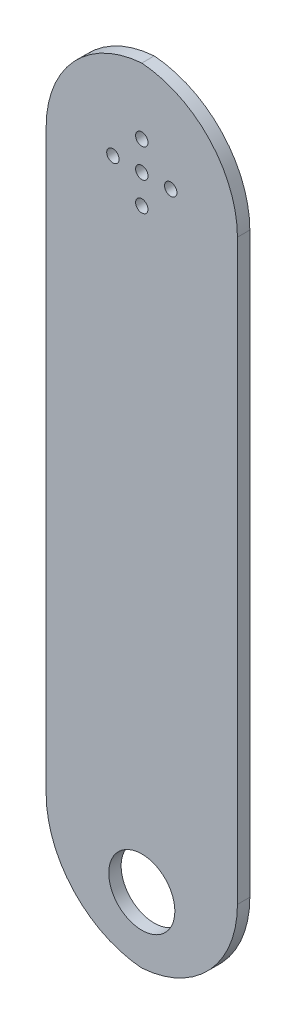
ISO-10303-21;
HEADER;
FILE_DESCRIPTION(('STEP AP214'),'2;1');
FILE_NAME('part.step','',(''),(''),'','','');
FILE_SCHEMA(('AUTOMOTIVE_DESIGN { 1 0 10303 214 1 1 1 1 }'));
ENDSEC;
DATA;
#1=APPLICATION_CONTEXT('core data for automotive mechanical design processes');
#2=APPLICATION_PROTOCOL_DEFINITION('international standard','automotive_design',2000,#1);
#3=PRODUCT_CONTEXT('',#1,'mechanical');
#4=PRODUCT('Part','Part','',(#3));
#5=PRODUCT_RELATED_PRODUCT_CATEGORY('part','',(#4));
#6=PRODUCT_DEFINITION_FORMATION('','',#4);
#7=PRODUCT_DEFINITION_CONTEXT('part definition',#1,'design');
#8=PRODUCT_DEFINITION('design','',#6,#7);
#9=PRODUCT_DEFINITION_SHAPE('','',#8);
#10=(LENGTH_UNIT() NAMED_UNIT(*) SI_UNIT(.MILLI.,.METRE.));
#11=(NAMED_UNIT(*) PLANE_ANGLE_UNIT() SI_UNIT($,.RADIAN.));
#12=(NAMED_UNIT(*) SI_UNIT($,.STERADIAN.) SOLID_ANGLE_UNIT());
#13=UNCERTAINTY_MEASURE_WITH_UNIT(LENGTH_MEASURE(1.E-05),#10,'distance_accuracy_value','');
#14=(GEOMETRIC_REPRESENTATION_CONTEXT(3) GLOBAL_UNCERTAINTY_ASSIGNED_CONTEXT((#13)) GLOBAL_UNIT_ASSIGNED_CONTEXT((#10,
#11,#12)) REPRESENTATION_CONTEXT('',''));
#15=CARTESIAN_POINT('',(0.,0.,0.));
#16=DIRECTION('',(0.,0.,1.));
#17=DIRECTION('',(1.,0.,0.));
#18=AXIS2_PLACEMENT_3D('',#15,#16,#17);
#19=CARTESIAN_POINT('',(-23.15,0.,3.));
#20=DIRECTION('',(-1.,0.,0.));
#21=DIRECTION('',(0.,-1.,0.));
#22=AXIS2_PLACEMENT_3D('',#19,#20,#21);
#23=PLANE('',#22);
#24=DIRECTION('',(0.,1.,0.));
#25=VECTOR('',#24,1.);
#26=CARTESIAN_POINT('',(-23.15,0.,0.));
#27=LINE('',#26,#25);
#28=CARTESIAN_POINT('',(-23.15,-69.93,0.));
#29=VERTEX_POINT('',#28);
#30=CARTESIAN_POINT('',(-23.15,69.93,0.));
#31=VERTEX_POINT('',#30);
#32=EDGE_CURVE('E104',#29,#31,#27,.T.);
#33=ORIENTED_EDGE('',*,*,#32,.F.);
#34=DIRECTION('',(0.,0.,-1.));
#35=VECTOR('',#34,1.);
#36=CARTESIAN_POINT('',(-23.15,-69.93,3.));
#37=LINE('',#36,#35);
#38=CARTESIAN_POINT('',(-23.15,-69.93,3.));
#39=VERTEX_POINT('',#38);
#40=EDGE_CURVE('E119',#29,#39,#37,.F.);
#41=ORIENTED_EDGE('',*,*,#40,.T.);
#42=DIRECTION('',(0.,1.,0.));
#43=VECTOR('',#42,1.);
#44=CARTESIAN_POINT('',(-23.15,0.,3.));
#45=LINE('',#44,#43);
#46=CARTESIAN_POINT('',(-23.15,69.93,3.));
#47=VERTEX_POINT('',#46);
#48=EDGE_CURVE('E211',#39,#47,#45,.T.);
#49=ORIENTED_EDGE('',*,*,#48,.T.);
#50=DIRECTION('',(0.,0.,-1.));
#51=VECTOR('',#50,1.);
#52=CARTESIAN_POINT('',(-23.15,69.93,0.));
#53=LINE('',#52,#51);
#54=EDGE_CURVE('E113',#47,#31,#53,.T.);
#55=ORIENTED_EDGE('',*,*,#54,.T.);
#56=EDGE_LOOP('',(#33,#41,#49,#55));
#57=FACE_BOUND('',#56,.T.);
#58=ADVANCED_FACE('F45',(#57),#23,.T.);
#59=CARTESIAN_POINT('',(23.15,0.,3.));
#60=DIRECTION('',(-1.,0.,0.));
#61=DIRECTION('',(0.,0.,1.));
#62=AXIS2_PLACEMENT_3D('',#59,#60,#61);
#63=PLANE('',#62);
#64=DIRECTION('',(0.,1.,0.));
#65=VECTOR('',#64,1.);
#66=CARTESIAN_POINT('',(23.15,0.,3.));
#67=LINE('',#66,#65);
#68=CARTESIAN_POINT('',(23.15,-69.93,3.));
#69=VERTEX_POINT('',#68);
#70=CARTESIAN_POINT('',(23.15,69.93,3.));
#71=VERTEX_POINT('',#70);
#72=EDGE_CURVE('E208',#69,#71,#67,.T.);
#73=ORIENTED_EDGE('',*,*,#72,.F.);
#74=DIRECTION('',(0.,0.,-1.));
#75=VECTOR('',#74,1.);
#76=CARTESIAN_POINT('',(23.15,-69.93,0.));
#77=LINE('',#76,#75);
#78=CARTESIAN_POINT('',(23.15,-69.93,0.));
#79=VERTEX_POINT('',#78);
#80=EDGE_CURVE('E11',#69,#79,#77,.T.);
#81=ORIENTED_EDGE('',*,*,#80,.T.);
#82=DIRECTION('',(0.,1.,0.));
#83=VECTOR('',#82,1.);
#84=CARTESIAN_POINT('',(23.15,0.,0.));
#85=LINE('',#84,#83);
#86=CARTESIAN_POINT('',(23.15,69.93,0.));
#87=VERTEX_POINT('',#86);
#88=EDGE_CURVE('E122',#79,#87,#85,.T.);
#89=ORIENTED_EDGE('',*,*,#88,.T.);
#90=DIRECTION('',(0.,0.,-1.));
#91=VECTOR('',#90,1.);
#92=CARTESIAN_POINT('',(23.15,69.93,3.));
#93=LINE('',#92,#91);
#94=EDGE_CURVE('E55',#87,#71,#93,.F.);
#95=ORIENTED_EDGE('',*,*,#94,.T.);
#96=EDGE_LOOP('',(#73,#81,#89,#95));
#97=FACE_BOUND('',#96,.T.);
#98=ADVANCED_FACE('F251',(#97),#63,.F.);
#99=CARTESIAN_POINT('',(-7.,71.93,3.));
#100=DIRECTION('',(0.,0.,-1.));
#101=DIRECTION('',(-1.,0.,0.));
#102=AXIS2_PLACEMENT_3D('',#99,#100,#101);
#103=CYLINDRICAL_SURFACE('',#102,1.5);
#104=CARTESIAN_POINT('',(-7.,71.93,3.));
#105=DIRECTION('',(0.,0.,1.));
#106=DIRECTION('',(1.,0.,0.));
#107=AXIS2_PLACEMENT_3D('',#104,#105,#106);
#108=CIRCLE('',#107,1.5);
#109=CARTESIAN_POINT('',(-5.5,71.93,3.));
#110=VERTEX_POINT('',#109);
#111=EDGE_CURVE('E165',#110,#110,#108,.T.);
#112=ORIENTED_EDGE('',*,*,#111,.T.);
#113=EDGE_LOOP('',(#112));
#114=FACE_BOUND('',#113,.T.);
#115=CARTESIAN_POINT('',(-7.,71.93,0.));
#116=DIRECTION('',(0.,0.,1.));
#117=DIRECTION('',(1.,0.,0.));
#118=AXIS2_PLACEMENT_3D('',#115,#116,#117);
#119=CIRCLE('',#118,1.5);
#120=CARTESIAN_POINT('',(-5.5,71.93,0.));
#121=VERTEX_POINT('',#120);
#122=EDGE_CURVE('E175',#121,#121,#119,.T.);
#123=ORIENTED_EDGE('',*,*,#122,.F.);
#124=EDGE_LOOP('',(#123));
#125=FACE_BOUND('',#124,.T.);
#126=ADVANCED_FACE('F256',(#114,#125),#103,.F.);
#127=CARTESIAN_POINT('',(0.,64.93,3.));
#128=DIRECTION('',(0.,0.,-1.));
#129=DIRECTION('',(-1.,0.,0.));
#130=AXIS2_PLACEMENT_3D('',#127,#128,#129);
#131=CYLINDRICAL_SURFACE('',#130,1.5);
#132=CARTESIAN_POINT('',(0.,64.93,3.));
#133=DIRECTION('',(0.,0.,1.));
#134=DIRECTION('',(1.,0.,0.));
#135=AXIS2_PLACEMENT_3D('',#132,#133,#134);
#136=CIRCLE('',#135,1.5);
#137=CARTESIAN_POINT('',(1.5,64.93,3.));
#138=VERTEX_POINT('',#137);
#139=EDGE_CURVE('E196',#138,#138,#136,.T.);
#140=ORIENTED_EDGE('',*,*,#139,.T.);
#141=EDGE_LOOP('',(#140));
#142=FACE_BOUND('',#141,.T.);
#143=CARTESIAN_POINT('',(0.,64.93,0.));
#144=DIRECTION('',(0.,0.,1.));
#145=DIRECTION('',(1.,0.,0.));
#146=AXIS2_PLACEMENT_3D('',#143,#144,#145);
#147=CIRCLE('',#146,1.5);
#148=CARTESIAN_POINT('',(1.5,64.93,0.));
#149=VERTEX_POINT('',#148);
#150=EDGE_CURVE('E179',#149,#149,#147,.T.);
#151=ORIENTED_EDGE('',*,*,#150,.F.);
#152=EDGE_LOOP('',(#151));
#153=FACE_BOUND('',#152,.T.);
#154=ADVANCED_FACE('F339',(#142,#153),#131,.F.);
#155=CARTESIAN_POINT('',(7.,71.93,3.));
#156=DIRECTION('',(0.,0.,-1.));
#157=DIRECTION('',(-1.,0.,0.));
#158=AXIS2_PLACEMENT_3D('',#155,#156,#157);
#159=CYLINDRICAL_SURFACE('',#158,1.5);
#160=CARTESIAN_POINT('',(7.,71.93,3.));
#161=DIRECTION('',(0.,0.,1.));
#162=DIRECTION('',(1.,0.,0.));
#163=AXIS2_PLACEMENT_3D('',#160,#161,#162);
#164=CIRCLE('',#163,1.5);
#165=CARTESIAN_POINT('',(8.5,71.93,3.));
#166=VERTEX_POINT('',#165);
#167=EDGE_CURVE('E200',#166,#166,#164,.T.);
#168=ORIENTED_EDGE('',*,*,#167,.T.);
#169=EDGE_LOOP('',(#168));
#170=FACE_BOUND('',#169,.T.);
#171=CARTESIAN_POINT('',(7.,71.93,0.));
#172=DIRECTION('',(0.,0.,1.));
#173=DIRECTION('',(1.,0.,0.));
#174=AXIS2_PLACEMENT_3D('',#171,#172,#173);
#175=CIRCLE('',#174,1.5);
#176=CARTESIAN_POINT('',(8.5,71.93,0.));
#177=VERTEX_POINT('',#176);
#178=EDGE_CURVE('E183',#177,#177,#175,.T.);
#179=ORIENTED_EDGE('',*,*,#178,.F.);
#180=EDGE_LOOP('',(#179));
#181=FACE_BOUND('',#180,.T.);
#182=ADVANCED_FACE('F329',(#170,#181),#159,.F.);
#183=CARTESIAN_POINT('',(0.,78.93,3.));
#184=DIRECTION('',(0.,0.,-1.));
#185=DIRECTION('',(-1.,0.,0.));
#186=AXIS2_PLACEMENT_3D('',#183,#184,#185);
#187=CYLINDRICAL_SURFACE('',#186,1.5);
#188=CARTESIAN_POINT('',(0.,78.93,3.));
#189=DIRECTION('',(0.,0.,1.));
#190=DIRECTION('',(1.,0.,0.));
#191=AXIS2_PLACEMENT_3D('',#188,#189,#190);
#192=CIRCLE('',#191,1.5);
#193=CARTESIAN_POINT('',(1.5,78.93,3.));
#194=VERTEX_POINT('',#193);
#195=EDGE_CURVE('E204',#194,#194,#192,.T.);
#196=ORIENTED_EDGE('',*,*,#195,.T.);
#197=EDGE_LOOP('',(#196));
#198=FACE_BOUND('',#197,.T.);
#199=CARTESIAN_POINT('',(0.,78.93,0.));
#200=DIRECTION('',(0.,0.,1.));
#201=DIRECTION('',(1.,0.,0.));
#202=AXIS2_PLACEMENT_3D('',#199,#200,#201);
#203=CIRCLE('',#202,1.5);
#204=CARTESIAN_POINT('',(1.5,78.93,0.));
#205=VERTEX_POINT('',#204);
#206=EDGE_CURVE('E187',#205,#205,#203,.T.);
#207=ORIENTED_EDGE('',*,*,#206,.F.);
#208=EDGE_LOOP('',(#207));
#209=FACE_BOUND('',#208,.T.);
#210=ADVANCED_FACE('F263',(#198,#209),#187,.F.);
#211=CARTESIAN_POINT('',(0.,-78.93,3.));
#212=DIRECTION('',(0.,0.,-1.));
#213=DIRECTION('',(-1.,0.,0.));
#214=AXIS2_PLACEMENT_3D('',#211,#212,#213);
#215=CYLINDRICAL_SURFACE('',#214,8.);
#216=CARTESIAN_POINT('',(0.,-78.93,3.));
#217=DIRECTION('',(0.,0.,1.));
#218=DIRECTION('',(1.,0.,0.));
#219=AXIS2_PLACEMENT_3D('',#216,#217,#218);
#220=CIRCLE('',#219,8.);
#221=CARTESIAN_POINT('',(8.00000000000001,-78.93,3.));
#222=VERTEX_POINT('',#221);
#223=EDGE_CURVE('E174',#222,#222,#220,.T.);
#224=ORIENTED_EDGE('',*,*,#223,.T.);
#225=EDGE_LOOP('',(#224));
#226=FACE_BOUND('',#225,.T.);
#227=CARTESIAN_POINT('',(0.,-78.93,0.));
#228=DIRECTION('',(0.,0.,1.));
#229=DIRECTION('',(1.,0.,0.));
#230=AXIS2_PLACEMENT_3D('',#227,#228,#229);
#231=CIRCLE('',#230,8.);
#232=CARTESIAN_POINT('',(8.00000000000001,-78.93,0.));
#233=VERTEX_POINT('',#232);
#234=EDGE_CURVE('E123',#233,#233,#231,.T.);
#235=ORIENTED_EDGE('',*,*,#234,.F.);
#236=EDGE_LOOP('',(#235));
#237=FACE_BOUND('',#236,.T.);
#238=ADVANCED_FACE('F218',(#226,#237),#215,.F.);
#239=CARTESIAN_POINT('',(0.,71.93,3.));
#240=DIRECTION('',(0.,0.,-1.));
#241=DIRECTION('',(-1.,0.,0.));
#242=AXIS2_PLACEMENT_3D('',#239,#240,#241);
#243=CYLINDRICAL_SURFACE('',#242,1.5);
#244=CARTESIAN_POINT('',(0.,71.93,3.));
#245=DIRECTION('',(0.,0.,1.));
#246=DIRECTION('',(1.,0.,0.));
#247=AXIS2_PLACEMENT_3D('',#244,#245,#246);
#248=CIRCLE('',#247,1.5);
#249=CARTESIAN_POINT('',(1.5,71.93,3.));
#250=VERTEX_POINT('',#249);
#251=EDGE_CURVE('E159',#250,#250,#248,.T.);
#252=ORIENTED_EDGE('',*,*,#251,.T.);
#253=EDGE_LOOP('',(#252));
#254=FACE_BOUND('',#253,.T.);
#255=CARTESIAN_POINT('',(0.,71.93,0.));
#256=DIRECTION('',(0.,0.,1.));
#257=DIRECTION('',(1.,0.,0.));
#258=AXIS2_PLACEMENT_3D('',#255,#256,#257);
#259=CIRCLE('',#258,1.5);
#260=CARTESIAN_POINT('',(1.5,71.93,0.));
#261=VERTEX_POINT('',#260);
#262=EDGE_CURVE('E168',#261,#261,#259,.T.);
#263=ORIENTED_EDGE('',*,*,#262,.F.);
#264=EDGE_LOOP('',(#263));
#265=FACE_BOUND('',#264,.T.);
#266=ADVANCED_FACE('F223',(#254,#265),#243,.F.);
#267=CARTESIAN_POINT('',(0.,0.,3.));
#268=DIRECTION('',(0.,0.,1.));
#269=DIRECTION('',(1.,0.,0.));
#270=AXIS2_PLACEMENT_3D('',#267,#268,#269);
#271=PLANE('',#270);
#272=ORIENTED_EDGE('',*,*,#223,.F.);
#273=EDGE_LOOP('',(#272));
#274=FACE_BOUND('',#273,.T.);
#275=ORIENTED_EDGE('',*,*,#48,.F.);
#276=CARTESIAN_POINT('',(1.85000000000001,-69.93,3.));
#277=DIRECTION('',(0.,0.,1.));
#278=DIRECTION('',(1.,0.,0.));
#279=AXIS2_PLACEMENT_3D('',#276,#277,#278);
#280=CIRCLE('',#279,25.);
#281=CARTESIAN_POINT('',(0.,-94.8614560344959,3.));
#282=VERTEX_POINT('',#281);
#283=EDGE_CURVE('E63',#39,#282,#280,.T.);
#284=ORIENTED_EDGE('',*,*,#283,.T.);
#285=CARTESIAN_POINT('',(-1.85,-69.93,3.));
#286=DIRECTION('',(0.,0.,1.));
#287=DIRECTION('',(1.,0.,0.));
#288=AXIS2_PLACEMENT_3D('',#285,#286,#287);
#289=CIRCLE('',#288,25.);
#290=EDGE_CURVE('E136',#282,#69,#289,.T.);
#291=ORIENTED_EDGE('',*,*,#290,.T.);
#292=ORIENTED_EDGE('',*,*,#72,.T.);
#293=CARTESIAN_POINT('',(-1.85,69.93,3.));
#294=DIRECTION('',(0.,0.,1.));
#295=DIRECTION('',(1.,0.,0.));
#296=AXIS2_PLACEMENT_3D('',#293,#294,#295);
#297=CIRCLE('',#296,25.);
#298=CARTESIAN_POINT('',(0.,94.8614560344959,3.));
#299=VERTEX_POINT('',#298);
#300=EDGE_CURVE('E70',#71,#299,#297,.T.);
#301=ORIENTED_EDGE('',*,*,#300,.T.);
#302=CARTESIAN_POINT('',(1.85,69.93,3.));
#303=DIRECTION('',(0.,0.,1.));
#304=DIRECTION('',(1.,0.,0.));
#305=AXIS2_PLACEMENT_3D('',#302,#303,#304);
#306=CIRCLE('',#305,25.);
#307=EDGE_CURVE('E130',#299,#47,#306,.T.);
#308=ORIENTED_EDGE('',*,*,#307,.T.);
#309=EDGE_LOOP('',(#275,#284,#291,#292,#301,#308));
#310=FACE_BOUND('',#309,.T.);
#311=ORIENTED_EDGE('',*,*,#195,.F.);
#312=EDGE_LOOP('',(#311));
#313=FACE_BOUND('',#312,.T.);
#314=ORIENTED_EDGE('',*,*,#167,.F.);
#315=EDGE_LOOP('',(#314));
#316=FACE_BOUND('',#315,.T.);
#317=ORIENTED_EDGE('',*,*,#139,.F.);
#318=EDGE_LOOP('',(#317));
#319=FACE_BOUND('',#318,.T.);
#320=ORIENTED_EDGE('',*,*,#111,.F.);
#321=EDGE_LOOP('',(#320));
#322=FACE_BOUND('',#321,.T.);
#323=ORIENTED_EDGE('',*,*,#251,.F.);
#324=EDGE_LOOP('',(#323));
#325=FACE_BOUND('',#324,.T.);
#326=ADVANCED_FACE('F221',(#274,#310,#313,#316,#319,#322,#325),#271,.T.);
#327=CARTESIAN_POINT('',(0.,0.,0.));
#328=DIRECTION('',(0.,0.,1.));
#329=DIRECTION('',(1.,0.,0.));
#330=AXIS2_PLACEMENT_3D('',#327,#328,#329);
#331=PLANE('',#330);
#332=ORIENTED_EDGE('',*,*,#234,.T.);
#333=EDGE_LOOP('',(#332));
#334=FACE_BOUND('',#333,.T.);
#335=CARTESIAN_POINT('',(-1.85,-69.93,0.));
#336=DIRECTION('',(0.,0.,1.));
#337=DIRECTION('',(1.,0.,0.));
#338=AXIS2_PLACEMENT_3D('',#335,#336,#337);
#339=CIRCLE('',#338,25.);
#340=CARTESIAN_POINT('',(0.,-94.8614560344959,0.));
#341=VERTEX_POINT('',#340);
#342=EDGE_CURVE('E107',#79,#341,#339,.F.);
#343=ORIENTED_EDGE('',*,*,#342,.T.);
#344=CARTESIAN_POINT('',(1.85000000000001,-69.93,0.));
#345=DIRECTION('',(0.,0.,1.));
#346=DIRECTION('',(1.,0.,0.));
#347=AXIS2_PLACEMENT_3D('',#344,#345,#346);
#348=CIRCLE('',#347,25.);
#349=EDGE_CURVE('E100',#341,#29,#348,.F.);
#350=ORIENTED_EDGE('',*,*,#349,.T.);
#351=ORIENTED_EDGE('',*,*,#32,.T.);
#352=CARTESIAN_POINT('',(1.85,69.93,0.));
#353=DIRECTION('',(0.,0.,1.));
#354=DIRECTION('',(1.,0.,0.));
#355=AXIS2_PLACEMENT_3D('',#352,#353,#354);
#356=CIRCLE('',#355,25.);
#357=CARTESIAN_POINT('',(0.,94.8614560344959,0.));
#358=VERTEX_POINT('',#357);
#359=EDGE_CURVE('E152',#31,#358,#356,.F.);
#360=ORIENTED_EDGE('',*,*,#359,.T.);
#361=CARTESIAN_POINT('',(-1.85,69.93,0.));
#362=DIRECTION('',(0.,0.,1.));
#363=DIRECTION('',(1.,0.,0.));
#364=AXIS2_PLACEMENT_3D('',#361,#362,#363);
#365=CIRCLE('',#364,25.);
#366=EDGE_CURVE('E156',#358,#87,#365,.F.);
#367=ORIENTED_EDGE('',*,*,#366,.T.);
#368=ORIENTED_EDGE('',*,*,#88,.F.);
#369=EDGE_LOOP('',(#343,#350,#351,#360,#367,#368));
#370=FACE_BOUND('',#369,.T.);
#371=ORIENTED_EDGE('',*,*,#206,.T.);
#372=EDGE_LOOP('',(#371));
#373=FACE_BOUND('',#372,.T.);
#374=ORIENTED_EDGE('',*,*,#178,.T.);
#375=EDGE_LOOP('',(#374));
#376=FACE_BOUND('',#375,.T.);
#377=ORIENTED_EDGE('',*,*,#150,.T.);
#378=EDGE_LOOP('',(#377));
#379=FACE_BOUND('',#378,.T.);
#380=ORIENTED_EDGE('',*,*,#122,.T.);
#381=EDGE_LOOP('',(#380));
#382=FACE_BOUND('',#381,.T.);
#383=ORIENTED_EDGE('',*,*,#262,.T.);
#384=EDGE_LOOP('',(#383));
#385=FACE_BOUND('',#384,.T.);
#386=ADVANCED_FACE('F102',(#334,#370,#373,#376,#379,#382,#385),#331,.F.);
#387=CARTESIAN_POINT('',(-1.85,-69.93,3.));
#388=DIRECTION('',(0.,0.,1.));
#389=DIRECTION('',(1.,0.,0.));
#390=AXIS2_PLACEMENT_3D('',#387,#388,#389);
#391=CYLINDRICAL_SURFACE('',#390,25.);
#392=ORIENTED_EDGE('',*,*,#80,.F.);
#393=ORIENTED_EDGE('',*,*,#290,.F.);
#394=DIRECTION('',(0.,0.,1.));
#395=VECTOR('',#394,1.);
#396=CARTESIAN_POINT('',(0.,-94.8614560344959,1.5));
#397=LINE('',#396,#395);
#398=EDGE_CURVE('E142',#341,#282,#397,.T.);
#399=ORIENTED_EDGE('',*,*,#398,.F.);
#400=ORIENTED_EDGE('',*,*,#342,.F.);
#401=EDGE_LOOP('',(#392,#393,#399,#400));
#402=FACE_BOUND('',#401,.T.);
#403=ADVANCED_FACE('F242',(#402),#391,.T.);
#404=CARTESIAN_POINT('',(1.85000000000001,-69.93,3.));
#405=DIRECTION('',(0.,0.,-1.));
#406=DIRECTION('',(-1.,0.,0.));
#407=AXIS2_PLACEMENT_3D('',#404,#405,#406);
#408=CYLINDRICAL_SURFACE('',#407,25.);
#409=ORIENTED_EDGE('',*,*,#283,.F.);
#410=ORIENTED_EDGE('',*,*,#40,.F.);
#411=ORIENTED_EDGE('',*,*,#349,.F.);
#412=ORIENTED_EDGE('',*,*,#398,.T.);
#413=EDGE_LOOP('',(#409,#410,#411,#412));
#414=FACE_BOUND('',#413,.T.);
#415=ADVANCED_FACE('F125',(#414),#408,.T.);
#416=CARTESIAN_POINT('',(-1.85,69.93,3.));
#417=DIRECTION('',(0.,0.,-1.));
#418=DIRECTION('',(-1.,0.,0.));
#419=AXIS2_PLACEMENT_3D('',#416,#417,#418);
#420=CYLINDRICAL_SURFACE('',#419,25.);
#421=DIRECTION('',(0.,0.,-1.));
#422=VECTOR('',#421,1.);
#423=CARTESIAN_POINT('',(0.,94.8614560344958,1.5));
#424=LINE('',#423,#422);
#425=EDGE_CURVE('E49',#299,#358,#424,.T.);
#426=ORIENTED_EDGE('',*,*,#425,.F.);
#427=ORIENTED_EDGE('',*,*,#300,.F.);
#428=ORIENTED_EDGE('',*,*,#94,.F.);
#429=ORIENTED_EDGE('',*,*,#366,.F.);
#430=EDGE_LOOP('',(#426,#427,#428,#429));
#431=FACE_BOUND('',#430,.T.);
#432=ADVANCED_FACE('F47',(#431),#420,.T.);
#433=CARTESIAN_POINT('',(1.85,69.93,3.));
#434=DIRECTION('',(0.,0.,1.));
#435=DIRECTION('',(1.,0.,0.));
#436=AXIS2_PLACEMENT_3D('',#433,#434,#435);
#437=CYLINDRICAL_SURFACE('',#436,25.);
#438=ORIENTED_EDGE('',*,*,#307,.F.);
#439=ORIENTED_EDGE('',*,*,#425,.T.);
#440=ORIENTED_EDGE('',*,*,#359,.F.);
#441=ORIENTED_EDGE('',*,*,#54,.F.);
#442=EDGE_LOOP('',(#438,#439,#440,#441));
#443=FACE_BOUND('',#442,.T.);
#444=ADVANCED_FACE('F151',(#443),#437,.T.);
#445=CLOSED_SHELL('',(#58,#98,#126,#154,#182,#210,#238,#266,#326,#386,#403,#415,#432,#444));
#446=MANIFOLD_SOLID_BREP('B2',#445);
#447=ADVANCED_BREP_SHAPE_REPRESENTATION('',(#18,#446),#14);
#448=SHAPE_DEFINITION_REPRESENTATION(#9,#447);
ENDSEC;
END-ISO-10303-21;
